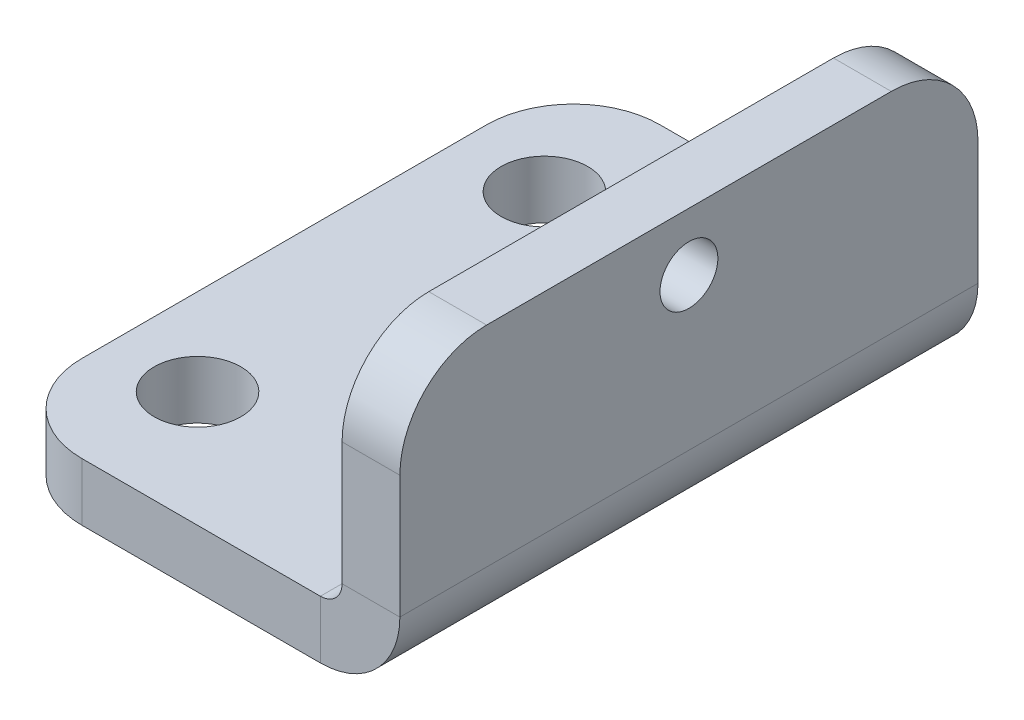
ISO-10303-21;
HEADER;
FILE_DESCRIPTION(('STEP AP214'),'2;1');
FILE_NAME('part.step','',(''),(''),'','','');
FILE_SCHEMA(('AUTOMOTIVE_DESIGN { 1 0 10303 214 1 1 1 1 }'));
ENDSEC;
DATA;
#1=APPLICATION_CONTEXT('core data for automotive mechanical design processes');
#2=APPLICATION_PROTOCOL_DEFINITION('international standard','automotive_design',2000,#1);
#3=PRODUCT_CONTEXT('',#1,'mechanical');
#4=PRODUCT('Part','Part','',(#3));
#5=PRODUCT_RELATED_PRODUCT_CATEGORY('part','',(#4));
#6=PRODUCT_DEFINITION_FORMATION('','',#4);
#7=PRODUCT_DEFINITION_CONTEXT('part definition',#1,'design');
#8=PRODUCT_DEFINITION('design','',#6,#7);
#9=PRODUCT_DEFINITION_SHAPE('','',#8);
#10=(LENGTH_UNIT() NAMED_UNIT(*) SI_UNIT(.MILLI.,.METRE.));
#11=(NAMED_UNIT(*) PLANE_ANGLE_UNIT() SI_UNIT($,.RADIAN.));
#12=(NAMED_UNIT(*) SI_UNIT($,.STERADIAN.) SOLID_ANGLE_UNIT());
#13=UNCERTAINTY_MEASURE_WITH_UNIT(LENGTH_MEASURE(1.E-05),#10,'distance_accuracy_value','');
#14=(GEOMETRIC_REPRESENTATION_CONTEXT(3) GLOBAL_UNCERTAINTY_ASSIGNED_CONTEXT((#13)) GLOBAL_UNIT_ASSIGNED_CONTEXT((#10,
#11,#12)) REPRESENTATION_CONTEXT('',''));
#15=CARTESIAN_POINT('',(0.,0.,0.));
#16=DIRECTION('',(0.,0.,1.));
#17=DIRECTION('',(1.,0.,0.));
#18=AXIS2_PLACEMENT_3D('',#15,#16,#17);
#19=CARTESIAN_POINT('',(0.,0.75,10.));
#20=DIRECTION('',(0.,0.,1.));
#21=DIRECTION('',(1.,0.,0.));
#22=AXIS2_PLACEMENT_3D('',#19,#20,#21);
#23=PLANE('',#22);
#24=DIRECTION('',(1.,0.,0.));
#25=VECTOR('',#24,1.);
#26=CARTESIAN_POINT('',(0.,0.75,10.));
#27=LINE('',#26,#25);
#28=CARTESIAN_POINT('',(0.,0.75,10.));
#29=VERTEX_POINT('',#28);
#30=CARTESIAN_POINT('',(2.,0.75,10.));
#31=VERTEX_POINT('',#30);
#32=EDGE_CURVE('E128',#29,#31,#27,.T.);
#33=ORIENTED_EDGE('',*,*,#32,.F.);
#34=CARTESIAN_POINT('',(-0.75,0.75,10.));
#35=DIRECTION('',(0.,0.,-1.));
#36=DIRECTION('',(-1.,0.,0.));
#37=AXIS2_PLACEMENT_3D('',#34,#35,#36);
#38=CIRCLE('',#37,0.75);
#39=CARTESIAN_POINT('',(-0.750000000000001,0.,10.));
#40=VERTEX_POINT('',#39);
#41=EDGE_CURVE('E132',#40,#29,#38,.F.);
#42=ORIENTED_EDGE('',*,*,#41,.F.);
#43=DIRECTION('',(0.,1.,0.));
#44=VECTOR('',#43,1.);
#45=CARTESIAN_POINT('',(-0.750000000000001,-2.,10.));
#46=LINE('',#45,#44);
#47=CARTESIAN_POINT('',(-0.750000000000001,-2.,10.));
#48=VERTEX_POINT('',#47);
#49=EDGE_CURVE('E140',#48,#40,#46,.T.);
#50=ORIENTED_EDGE('',*,*,#49,.F.);
#51=CARTESIAN_POINT('',(-0.75,0.75,10.));
#52=DIRECTION('',(0.,0.,1.));
#53=DIRECTION('',(1.,0.,0.));
#54=AXIS2_PLACEMENT_3D('',#51,#52,#53);
#55=CIRCLE('',#54,2.75);
#56=EDGE_CURVE('E134',#48,#31,#55,.T.);
#57=ORIENTED_EDGE('',*,*,#56,.T.);
#58=EDGE_LOOP('',(#33,#42,#50,#57));
#59=FACE_BOUND('',#58,.T.);
#60=ADVANCED_FACE('F38',(#59),#23,.T.);
#61=CARTESIAN_POINT('',(-0.750000000000001,-2.,10.));
#62=DIRECTION('',(0.,0.,1.));
#63=DIRECTION('',(1.,0.,0.));
#64=AXIS2_PLACEMENT_3D('',#61,#62,#63);
#65=PLANE('',#64);
#66=DIRECTION('',(0.,1.,0.));
#67=VECTOR('',#66,1.);
#68=CARTESIAN_POINT('',(2.,0.,10.));
#69=LINE('',#68,#67);
#70=CARTESIAN_POINT('',(2.,5.,10.));
#71=VERTEX_POINT('',#70);
#72=EDGE_CURVE('E161',#31,#71,#69,.T.);
#73=ORIENTED_EDGE('',*,*,#72,.T.);
#74=DIRECTION('',(1.,0.,0.));
#75=VECTOR('',#74,1.);
#76=CARTESIAN_POINT('',(-0.750000000000001,5.,10.));
#77=LINE('',#76,#75);
#78=CARTESIAN_POINT('',(0.,5.,10.));
#79=VERTEX_POINT('',#78);
#80=EDGE_CURVE('E46',#71,#79,#77,.F.);
#81=ORIENTED_EDGE('',*,*,#80,.T.);
#82=DIRECTION('',(0.,1.,0.));
#83=VECTOR('',#82,1.);
#84=CARTESIAN_POINT('',(0.,0.,10.));
#85=LINE('',#84,#83);
#86=EDGE_CURVE('E149',#29,#79,#85,.T.);
#87=ORIENTED_EDGE('',*,*,#86,.F.);
#88=ORIENTED_EDGE('',*,*,#32,.T.);
#89=EDGE_LOOP('',(#73,#81,#87,#88));
#90=FACE_BOUND('',#89,.T.);
#91=ADVANCED_FACE('F159',(#90),#65,.T.);
#92=CARTESIAN_POINT('',(-0.750000000000001,0.,-10.));
#93=DIRECTION('',(0.,0.,-1.));
#94=DIRECTION('',(-1.,0.,0.));
#95=AXIS2_PLACEMENT_3D('',#92,#93,#94);
#96=PLANE('',#95);
#97=DIRECTION('',(0.,-1.,0.));
#98=VECTOR('',#97,1.);
#99=CARTESIAN_POINT('',(-0.750000000000001,0.,-10.));
#100=LINE('',#99,#98);
#101=CARTESIAN_POINT('',(-0.750000000000001,0.,-10.));
#102=VERTEX_POINT('',#101);
#103=CARTESIAN_POINT('',(-0.750000000000001,-2.,-10.));
#104=VERTEX_POINT('',#103);
#105=EDGE_CURVE('E205',#102,#104,#100,.T.);
#106=ORIENTED_EDGE('',*,*,#105,.F.);
#107=CARTESIAN_POINT('',(-0.75,0.75,-10.));
#108=DIRECTION('',(0.,0.,-1.));
#109=DIRECTION('',(-1.,0.,0.));
#110=AXIS2_PLACEMENT_3D('',#107,#108,#109);
#111=CIRCLE('',#110,0.75);
#112=CARTESIAN_POINT('',(0.,0.75,-10.));
#113=VERTEX_POINT('',#112);
#114=EDGE_CURVE('E180',#102,#113,#111,.F.);
#115=ORIENTED_EDGE('',*,*,#114,.T.);
#116=DIRECTION('',(-1.,0.,0.));
#117=VECTOR('',#116,1.);
#118=CARTESIAN_POINT('',(2.,0.75,-10.));
#119=LINE('',#118,#117);
#120=CARTESIAN_POINT('',(2.,0.75,-10.));
#121=VERTEX_POINT('',#120);
#122=EDGE_CURVE('E203',#121,#113,#119,.T.);
#123=ORIENTED_EDGE('',*,*,#122,.F.);
#124=CARTESIAN_POINT('',(-0.75,0.75,-10.));
#125=DIRECTION('',(0.,0.,1.));
#126=DIRECTION('',(1.,0.,0.));
#127=AXIS2_PLACEMENT_3D('',#124,#125,#126);
#128=CIRCLE('',#127,2.75);
#129=EDGE_CURVE('E186',#104,#121,#128,.T.);
#130=ORIENTED_EDGE('',*,*,#129,.F.);
#131=EDGE_LOOP('',(#106,#115,#123,#130));
#132=FACE_BOUND('',#131,.T.);
#133=ADVANCED_FACE('F312',(#132),#96,.T.);
#134=CARTESIAN_POINT('',(2.,0.75,-10.));
#135=DIRECTION('',(0.,0.,-1.));
#136=DIRECTION('',(-1.,0.,0.));
#137=AXIS2_PLACEMENT_3D('',#134,#135,#136);
#138=PLANE('',#137);
#139=DIRECTION('',(1.,0.,0.));
#140=VECTOR('',#139,1.);
#141=CARTESIAN_POINT('',(-12.,-2.,-10.));
#142=LINE('',#141,#140);
#143=CARTESIAN_POINT('',(-9.,-2.,-10.));
#144=VERTEX_POINT('',#143);
#145=EDGE_CURVE('E184',#144,#104,#142,.T.);
#146=ORIENTED_EDGE('',*,*,#145,.F.);
#147=DIRECTION('',(0.,1.,0.));
#148=VECTOR('',#147,1.);
#149=CARTESIAN_POINT('',(-9.,0.75,-10.));
#150=LINE('',#149,#148);
#151=CARTESIAN_POINT('',(-9.,0.,-10.));
#152=VERTEX_POINT('',#151);
#153=EDGE_CURVE('E225',#144,#152,#150,.T.);
#154=ORIENTED_EDGE('',*,*,#153,.T.);
#155=DIRECTION('',(1.,0.,0.));
#156=VECTOR('',#155,1.);
#157=CARTESIAN_POINT('',(-12.,0.,-10.));
#158=LINE('',#157,#156);
#159=EDGE_CURVE('E182',#152,#102,#158,.T.);
#160=ORIENTED_EDGE('',*,*,#159,.T.);
#161=ORIENTED_EDGE('',*,*,#105,.T.);
#162=EDGE_LOOP('',(#146,#154,#160,#161));
#163=FACE_BOUND('',#162,.T.);
#164=ADVANCED_FACE('F247',(#163),#138,.T.);
#165=CARTESIAN_POINT('',(2.,0.,10.));
#166=DIRECTION('',(-1.,0.,0.));
#167=DIRECTION('',(0.,0.,1.));
#168=AXIS2_PLACEMENT_3D('',#165,#166,#167);
#169=PLANE('',#168);
#170=CARTESIAN_POINT('',(2.,6.,0.));
#171=DIRECTION('',(-1.,0.,0.));
#172=DIRECTION('',(0.,0.,1.));
#173=AXIS2_PLACEMENT_3D('',#170,#171,#172);
#174=CIRCLE('',#173,1.);
#175=CARTESIAN_POINT('',(2.,6.,1.));
#176=VERTEX_POINT('',#175);
#177=EDGE_CURVE('E277',#176,#176,#174,.T.);
#178=ORIENTED_EDGE('',*,*,#177,.T.);
#179=EDGE_LOOP('',(#178));
#180=FACE_BOUND('',#179,.T.);
#181=DIRECTION('',(0.,1.,0.));
#182=VECTOR('',#181,1.);
#183=CARTESIAN_POINT('',(2.,0.,-10.));
#184=LINE('',#183,#182);
#185=CARTESIAN_POINT('',(2.,5.,-10.));
#186=VERTEX_POINT('',#185);
#187=EDGE_CURVE('E175',#121,#186,#184,.T.);
#188=ORIENTED_EDGE('',*,*,#187,.T.);
#189=CARTESIAN_POINT('',(2.,5.,-7.));
#190=DIRECTION('',(-1.,0.,0.));
#191=DIRECTION('',(0.,0.,1.));
#192=AXIS2_PLACEMENT_3D('',#189,#190,#191);
#193=CIRCLE('',#192,3.);
#194=CARTESIAN_POINT('',(2.,8.,-7.));
#195=VERTEX_POINT('',#194);
#196=EDGE_CURVE('E214',#186,#195,#193,.F.);
#197=ORIENTED_EDGE('',*,*,#196,.T.);
#198=DIRECTION('',(0.,0.,-1.));
#199=VECTOR('',#198,1.);
#200=CARTESIAN_POINT('',(2.,8.,10.));
#201=LINE('',#200,#199);
#202=CARTESIAN_POINT('',(2.,8.,7.));
#203=VERTEX_POINT('',#202);
#204=EDGE_CURVE('E200',#203,#195,#201,.T.);
#205=ORIENTED_EDGE('',*,*,#204,.F.);
#206=CARTESIAN_POINT('',(2.,5.,7.));
#207=DIRECTION('',(-1.,0.,0.));
#208=DIRECTION('',(0.,0.,1.));
#209=AXIS2_PLACEMENT_3D('',#206,#207,#208);
#210=CIRCLE('',#209,3.);
#211=EDGE_CURVE('E212',#203,#71,#210,.F.);
#212=ORIENTED_EDGE('',*,*,#211,.T.);
#213=ORIENTED_EDGE('',*,*,#72,.F.);
#214=DIRECTION('',(0.,0.,-1.));
#215=VECTOR('',#214,1.);
#216=CARTESIAN_POINT('',(2.,0.75,10.));
#217=LINE('',#216,#215);
#218=EDGE_CURVE('E174',#31,#121,#217,.T.);
#219=ORIENTED_EDGE('',*,*,#218,.T.);
#220=EDGE_LOOP('',(#188,#197,#205,#212,#213,#219));
#221=FACE_BOUND('',#220,.T.);
#222=ADVANCED_FACE('F265',(#180,#221),#169,.F.);
#223=CARTESIAN_POINT('',(0.,8.,10.));
#224=DIRECTION('',(0.,1.,0.));
#225=DIRECTION('',(0.,0.,1.));
#226=AXIS2_PLACEMENT_3D('',#223,#224,#225);
#227=PLANE('',#226);
#228=ORIENTED_EDGE('',*,*,#204,.T.);
#229=DIRECTION('',(1.,0.,0.));
#230=VECTOR('',#229,1.);
#231=CARTESIAN_POINT('',(0.,8.,-7.));
#232=LINE('',#231,#230);
#233=CARTESIAN_POINT('',(0.,8.,-7.));
#234=VERTEX_POINT('',#233);
#235=EDGE_CURVE('E219',#195,#234,#232,.F.);
#236=ORIENTED_EDGE('',*,*,#235,.T.);
#237=DIRECTION('',(0.,0.,-1.));
#238=VECTOR('',#237,1.);
#239=CARTESIAN_POINT('',(0.,8.,10.));
#240=LINE('',#239,#238);
#241=CARTESIAN_POINT('',(0.,8.,7.));
#242=VERTEX_POINT('',#241);
#243=EDGE_CURVE('E156',#242,#234,#240,.T.);
#244=ORIENTED_EDGE('',*,*,#243,.F.);
#245=DIRECTION('',(1.,0.,0.));
#246=VECTOR('',#245,1.);
#247=CARTESIAN_POINT('',(0.,8.,7.));
#248=LINE('',#247,#246);
#249=EDGE_CURVE('E216',#242,#203,#248,.T.);
#250=ORIENTED_EDGE('',*,*,#249,.T.);
#251=EDGE_LOOP('',(#228,#236,#244,#250));
#252=FACE_BOUND('',#251,.T.);
#253=ADVANCED_FACE('F295',(#252),#227,.T.);
#254=CARTESIAN_POINT('',(0.,0.,10.));
#255=DIRECTION('',(-1.,0.,0.));
#256=DIRECTION('',(0.,0.,1.));
#257=AXIS2_PLACEMENT_3D('',#254,#255,#256);
#258=PLANE('',#257);
#259=CARTESIAN_POINT('',(0.,6.,0.));
#260=DIRECTION('',(-1.,0.,0.));
#261=DIRECTION('',(0.,0.,1.));
#262=AXIS2_PLACEMENT_3D('',#259,#260,#261);
#263=CIRCLE('',#262,1.);
#264=CARTESIAN_POINT('',(0.,6.,1.));
#265=VERTEX_POINT('',#264);
#266=EDGE_CURVE('E280',#265,#265,#263,.T.);
#267=ORIENTED_EDGE('',*,*,#266,.F.);
#268=EDGE_LOOP('',(#267));
#269=FACE_BOUND('',#268,.T.);
#270=ORIENTED_EDGE('',*,*,#243,.T.);
#271=CARTESIAN_POINT('',(0.,5.,-7.));
#272=DIRECTION('',(-1.,0.,0.));
#273=DIRECTION('',(0.,0.,1.));
#274=AXIS2_PLACEMENT_3D('',#271,#272,#273);
#275=CIRCLE('',#274,3.);
#276=CARTESIAN_POINT('',(0.,5.,-10.));
#277=VERTEX_POINT('',#276);
#278=EDGE_CURVE('E223',#234,#277,#275,.T.);
#279=ORIENTED_EDGE('',*,*,#278,.T.);
#280=DIRECTION('',(0.,1.,0.));
#281=VECTOR('',#280,1.);
#282=CARTESIAN_POINT('',(0.,0.,-10.));
#283=LINE('',#282,#281);
#284=EDGE_CURVE('E152',#113,#277,#283,.T.);
#285=ORIENTED_EDGE('',*,*,#284,.F.);
#286=DIRECTION('',(0.,0.,-1.));
#287=VECTOR('',#286,1.);
#288=CARTESIAN_POINT('',(0.,0.75,10.));
#289=LINE('',#288,#287);
#290=EDGE_CURVE('E146',#29,#113,#289,.T.);
#291=ORIENTED_EDGE('',*,*,#290,.F.);
#292=ORIENTED_EDGE('',*,*,#86,.T.);
#293=CARTESIAN_POINT('',(0.,5.,7.));
#294=DIRECTION('',(-1.,0.,0.));
#295=DIRECTION('',(0.,0.,1.));
#296=AXIS2_PLACEMENT_3D('',#293,#294,#295);
#297=CIRCLE('',#296,3.);
#298=EDGE_CURVE('E221',#79,#242,#297,.T.);
#299=ORIENTED_EDGE('',*,*,#298,.T.);
#300=EDGE_LOOP('',(#270,#279,#285,#291,#292,#299));
#301=FACE_BOUND('',#300,.T.);
#302=ADVANCED_FACE('F148',(#269,#301),#258,.T.);
#303=CARTESIAN_POINT('',(-0.75,0.75,10.));
#304=DIRECTION('',(0.,0.,-1.));
#305=DIRECTION('',(-1.,0.,0.));
#306=AXIS2_PLACEMENT_3D('',#303,#304,#305);
#307=CYLINDRICAL_SURFACE('',#306,0.75);
#308=ORIENTED_EDGE('',*,*,#114,.F.);
#309=DIRECTION('',(0.,0.,-1.));
#310=VECTOR('',#309,1.);
#311=CARTESIAN_POINT('',(-0.750000000000001,0.,10.));
#312=LINE('',#311,#310);
#313=EDGE_CURVE('E157',#40,#102,#312,.T.);
#314=ORIENTED_EDGE('',*,*,#313,.F.);
#315=ORIENTED_EDGE('',*,*,#41,.T.);
#316=ORIENTED_EDGE('',*,*,#290,.T.);
#317=EDGE_LOOP('',(#308,#314,#315,#316));
#318=FACE_BOUND('',#317,.T.);
#319=ADVANCED_FACE('F164',(#318),#307,.F.);
#320=CARTESIAN_POINT('',(-12.,0.,10.));
#321=DIRECTION('',(0.,1.,0.));
#322=DIRECTION('',(0.,0.,1.));
#323=AXIS2_PLACEMENT_3D('',#320,#321,#322);
#324=PLANE('',#323);
#325=CARTESIAN_POINT('',(-9.,0.,6.));
#326=DIRECTION('',(0.,1.,0.));
#327=DIRECTION('',(0.,0.,-1.));
#328=AXIS2_PLACEMENT_3D('',#325,#326,#327);
#329=CIRCLE('',#328,1.5);
#330=CARTESIAN_POINT('',(-9.,0.,4.5));
#331=VERTEX_POINT('',#330);
#332=EDGE_CURVE('E274',#331,#331,#329,.T.);
#333=ORIENTED_EDGE('',*,*,#332,.F.);
#334=EDGE_LOOP('',(#333));
#335=FACE_BOUND('',#334,.T.);
#336=CARTESIAN_POINT('',(-9.,0.,-6.));
#337=DIRECTION('',(0.,1.,0.));
#338=DIRECTION('',(0.,0.,1.));
#339=AXIS2_PLACEMENT_3D('',#336,#337,#338);
#340=CIRCLE('',#339,1.5);
#341=CARTESIAN_POINT('',(-9.,0.,-4.5));
#342=VERTEX_POINT('',#341);
#343=EDGE_CURVE('E268',#342,#342,#340,.T.);
#344=ORIENTED_EDGE('',*,*,#343,.F.);
#345=EDGE_LOOP('',(#344));
#346=FACE_BOUND('',#345,.T.);
#347=ORIENTED_EDGE('',*,*,#159,.F.);
#348=CARTESIAN_POINT('',(-9.,0.,-7.));
#349=DIRECTION('',(0.,1.,0.));
#350=DIRECTION('',(0.,0.,1.));
#351=AXIS2_PLACEMENT_3D('',#348,#349,#350);
#352=CIRCLE('',#351,3.);
#353=CARTESIAN_POINT('',(-12.,0.,-7.));
#354=VERTEX_POINT('',#353);
#355=EDGE_CURVE('E230',#152,#354,#352,.T.);
#356=ORIENTED_EDGE('',*,*,#355,.T.);
#357=DIRECTION('',(0.,0.,-1.));
#358=VECTOR('',#357,1.);
#359=CARTESIAN_POINT('',(-12.,0.,10.));
#360=LINE('',#359,#358);
#361=CARTESIAN_POINT('',(-12.,0.,7.));
#362=VERTEX_POINT('',#361);
#363=EDGE_CURVE('E196',#362,#354,#360,.T.);
#364=ORIENTED_EDGE('',*,*,#363,.F.);
#365=CARTESIAN_POINT('',(-9.,0.,7.));
#366=DIRECTION('',(0.,1.,0.));
#367=DIRECTION('',(0.,0.,1.));
#368=AXIS2_PLACEMENT_3D('',#365,#366,#367);
#369=CIRCLE('',#368,3.);
#370=CARTESIAN_POINT('',(-9.,0.,10.));
#371=VERTEX_POINT('',#370);
#372=EDGE_CURVE('E228',#362,#371,#369,.T.);
#373=ORIENTED_EDGE('',*,*,#372,.T.);
#374=DIRECTION('',(1.,0.,0.));
#375=VECTOR('',#374,1.);
#376=CARTESIAN_POINT('',(-12.,0.,10.));
#377=LINE('',#376,#375);
#378=EDGE_CURVE('E166',#371,#40,#377,.T.);
#379=ORIENTED_EDGE('',*,*,#378,.T.);
#380=ORIENTED_EDGE('',*,*,#313,.T.);
#381=EDGE_LOOP('',(#347,#356,#364,#373,#379,#380));
#382=FACE_BOUND('',#381,.T.);
#383=ADVANCED_FACE('F253',(#335,#346,#382),#324,.T.);
#384=CARTESIAN_POINT('',(-12.,-2.,10.));
#385=DIRECTION('',(-1.,0.,0.));
#386=DIRECTION('',(0.,0.,1.));
#387=AXIS2_PLACEMENT_3D('',#384,#385,#386);
#388=PLANE('',#387);
#389=ORIENTED_EDGE('',*,*,#363,.T.);
#390=DIRECTION('',(0.,1.,0.));
#391=VECTOR('',#390,1.);
#392=CARTESIAN_POINT('',(-12.,-2.,-7.));
#393=LINE('',#392,#391);
#394=CARTESIAN_POINT('',(-12.,-2.,-7.));
#395=VERTEX_POINT('',#394);
#396=EDGE_CURVE('E59',#354,#395,#393,.F.);
#397=ORIENTED_EDGE('',*,*,#396,.T.);
#398=DIRECTION('',(0.,0.,-1.));
#399=VECTOR('',#398,1.);
#400=CARTESIAN_POINT('',(-12.,-2.,10.));
#401=LINE('',#400,#399);
#402=CARTESIAN_POINT('',(-12.,-2.,7.));
#403=VERTEX_POINT('',#402);
#404=EDGE_CURVE('E194',#403,#395,#401,.T.);
#405=ORIENTED_EDGE('',*,*,#404,.F.);
#406=DIRECTION('',(0.,1.,0.));
#407=VECTOR('',#406,1.);
#408=CARTESIAN_POINT('',(-12.,0.,7.));
#409=LINE('',#408,#407);
#410=EDGE_CURVE('E232',#403,#362,#409,.T.);
#411=ORIENTED_EDGE('',*,*,#410,.T.);
#412=EDGE_LOOP('',(#389,#397,#405,#411));
#413=FACE_BOUND('',#412,.T.);
#414=ADVANCED_FACE('F254',(#413),#388,.T.);
#415=CARTESIAN_POINT('',(-12.,-2.,10.));
#416=DIRECTION('',(0.,1.,0.));
#417=DIRECTION('',(0.,0.,1.));
#418=AXIS2_PLACEMENT_3D('',#415,#416,#417);
#419=PLANE('',#418);
#420=CARTESIAN_POINT('',(-9.,-2.,6.));
#421=DIRECTION('',(0.,1.,0.));
#422=DIRECTION('',(0.,0.,-1.));
#423=AXIS2_PLACEMENT_3D('',#420,#421,#422);
#424=CIRCLE('',#423,1.5);
#425=CARTESIAN_POINT('',(-9.,-2.,4.5));
#426=VERTEX_POINT('',#425);
#427=EDGE_CURVE('E271',#426,#426,#424,.T.);
#428=ORIENTED_EDGE('',*,*,#427,.T.);
#429=EDGE_LOOP('',(#428));
#430=FACE_BOUND('',#429,.T.);
#431=CARTESIAN_POINT('',(-9.,-2.,-6.));
#432=DIRECTION('',(0.,1.,0.));
#433=DIRECTION('',(0.,0.,1.));
#434=AXIS2_PLACEMENT_3D('',#431,#432,#433);
#435=CIRCLE('',#434,1.5);
#436=CARTESIAN_POINT('',(-9.,-2.,-4.5));
#437=VERTEX_POINT('',#436);
#438=EDGE_CURVE('E178',#437,#437,#435,.T.);
#439=ORIENTED_EDGE('',*,*,#438,.T.);
#440=EDGE_LOOP('',(#439));
#441=FACE_BOUND('',#440,.T.);
#442=ORIENTED_EDGE('',*,*,#404,.T.);
#443=CARTESIAN_POINT('',(-9.,-2.,-7.));
#444=DIRECTION('',(0.,1.,0.));
#445=DIRECTION('',(0.,0.,1.));
#446=AXIS2_PLACEMENT_3D('',#443,#444,#445);
#447=CIRCLE('',#446,3.);
#448=EDGE_CURVE('E238',#395,#144,#447,.F.);
#449=ORIENTED_EDGE('',*,*,#448,.T.);
#450=ORIENTED_EDGE('',*,*,#145,.T.);
#451=DIRECTION('',(0.,0.,-1.));
#452=VECTOR('',#451,1.);
#453=CARTESIAN_POINT('',(-0.750000000000001,-2.,10.));
#454=LINE('',#453,#452);
#455=EDGE_CURVE('E191',#48,#104,#454,.T.);
#456=ORIENTED_EDGE('',*,*,#455,.F.);
#457=DIRECTION('',(1.,0.,0.));
#458=VECTOR('',#457,1.);
#459=CARTESIAN_POINT('',(-12.,-2.,10.));
#460=LINE('',#459,#458);
#461=CARTESIAN_POINT('',(-9.,-2.,10.));
#462=VERTEX_POINT('',#461);
#463=EDGE_CURVE('E168',#462,#48,#460,.T.);
#464=ORIENTED_EDGE('',*,*,#463,.F.);
#465=CARTESIAN_POINT('',(-9.,-2.,7.));
#466=DIRECTION('',(0.,1.,0.));
#467=DIRECTION('',(0.,0.,1.));
#468=AXIS2_PLACEMENT_3D('',#465,#466,#467);
#469=CIRCLE('',#468,3.);
#470=EDGE_CURVE('E236',#462,#403,#469,.F.);
#471=ORIENTED_EDGE('',*,*,#470,.T.);
#472=EDGE_LOOP('',(#442,#449,#450,#456,#464,#471));
#473=FACE_BOUND('',#472,.T.);
#474=ADVANCED_FACE('F242',(#430,#441,#473),#419,.F.);
#475=CARTESIAN_POINT('',(-0.75,0.75,10.));
#476=DIRECTION('',(0.,0.,-1.));
#477=DIRECTION('',(-1.,0.,0.));
#478=AXIS2_PLACEMENT_3D('',#475,#476,#477);
#479=CYLINDRICAL_SURFACE('',#478,2.75);
#480=ORIENTED_EDGE('',*,*,#129,.T.);
#481=ORIENTED_EDGE('',*,*,#218,.F.);
#482=ORIENTED_EDGE('',*,*,#56,.F.);
#483=ORIENTED_EDGE('',*,*,#455,.T.);
#484=EDGE_LOOP('',(#480,#481,#482,#483));
#485=FACE_BOUND('',#484,.T.);
#486=ADVANCED_FACE('F261',(#485),#479,.T.);
#487=CARTESIAN_POINT('',(-0.75,0.75,10.));
#488=DIRECTION('',(0.,0.,-1.));
#489=DIRECTION('',(-1.,0.,0.));
#490=AXIS2_PLACEMENT_3D('',#487,#488,#489);
#491=PLANE('',#490);
#492=ORIENTED_EDGE('',*,*,#378,.F.);
#493=DIRECTION('',(0.,1.,0.));
#494=VECTOR('',#493,1.);
#495=CARTESIAN_POINT('',(-9.,-2.,10.));
#496=LINE('',#495,#494);
#497=EDGE_CURVE('E11',#371,#462,#496,.F.);
#498=ORIENTED_EDGE('',*,*,#497,.T.);
#499=ORIENTED_EDGE('',*,*,#463,.T.);
#500=ORIENTED_EDGE('',*,*,#49,.T.);
#501=EDGE_LOOP('',(#492,#498,#499,#500));
#502=FACE_BOUND('',#501,.T.);
#503=ADVANCED_FACE('F258',(#502),#491,.F.);
#504=CARTESIAN_POINT('',(-0.75,0.75,-10.));
#505=DIRECTION('',(0.,0.,-1.));
#506=DIRECTION('',(-1.,0.,0.));
#507=AXIS2_PLACEMENT_3D('',#504,#505,#506);
#508=PLANE('',#507);
#509=ORIENTED_EDGE('',*,*,#284,.T.);
#510=DIRECTION('',(1.,0.,0.));
#511=VECTOR('',#510,1.);
#512=CARTESIAN_POINT('',(-0.75,5.,-10.));
#513=LINE('',#512,#511);
#514=EDGE_CURVE('E139',#277,#186,#513,.T.);
#515=ORIENTED_EDGE('',*,*,#514,.T.);
#516=ORIENTED_EDGE('',*,*,#187,.F.);
#517=ORIENTED_EDGE('',*,*,#122,.T.);
#518=EDGE_LOOP('',(#509,#515,#516,#517));
#519=FACE_BOUND('',#518,.T.);
#520=ADVANCED_FACE('F319',(#519),#508,.T.);
#521=CARTESIAN_POINT('',(-0.75,5.,-7.));
#522=DIRECTION('',(1.,0.,0.));
#523=DIRECTION('',(0.,0.,-1.));
#524=AXIS2_PLACEMENT_3D('',#521,#522,#523);
#525=CYLINDRICAL_SURFACE('',#524,3.);
#526=ORIENTED_EDGE('',*,*,#278,.F.);
#527=ORIENTED_EDGE('',*,*,#235,.F.);
#528=ORIENTED_EDGE('',*,*,#196,.F.);
#529=ORIENTED_EDGE('',*,*,#514,.F.);
#530=EDGE_LOOP('',(#526,#527,#528,#529));
#531=FACE_BOUND('',#530,.T.);
#532=ADVANCED_FACE('F316',(#531),#525,.T.);
#533=CARTESIAN_POINT('',(-9.,0.75,-7.));
#534=DIRECTION('',(0.,1.,0.));
#535=DIRECTION('',(0.,0.,1.));
#536=AXIS2_PLACEMENT_3D('',#533,#534,#535);
#537=CYLINDRICAL_SURFACE('',#536,3.);
#538=ORIENTED_EDGE('',*,*,#448,.F.);
#539=ORIENTED_EDGE('',*,*,#396,.F.);
#540=ORIENTED_EDGE('',*,*,#355,.F.);
#541=ORIENTED_EDGE('',*,*,#153,.F.);
#542=EDGE_LOOP('',(#538,#539,#540,#541));
#543=FACE_BOUND('',#542,.T.);
#544=ADVANCED_FACE('F250',(#543),#537,.T.);
#545=CARTESIAN_POINT('',(0.,5.,7.));
#546=DIRECTION('',(1.,0.,0.));
#547=DIRECTION('',(0.,0.,-1.));
#548=AXIS2_PLACEMENT_3D('',#545,#546,#547);
#549=CYLINDRICAL_SURFACE('',#548,3.);
#550=ORIENTED_EDGE('',*,*,#298,.F.);
#551=ORIENTED_EDGE('',*,*,#80,.F.);
#552=ORIENTED_EDGE('',*,*,#211,.F.);
#553=ORIENTED_EDGE('',*,*,#249,.F.);
#554=EDGE_LOOP('',(#550,#551,#552,#553));
#555=FACE_BOUND('',#554,.T.);
#556=ADVANCED_FACE('F322',(#555),#549,.T.);
#557=CARTESIAN_POINT('',(-9.,-2.,7.));
#558=DIRECTION('',(0.,-1.,0.));
#559=DIRECTION('',(0.,0.,-1.));
#560=AXIS2_PLACEMENT_3D('',#557,#558,#559);
#561=CYLINDRICAL_SURFACE('',#560,3.);
#562=ORIENTED_EDGE('',*,*,#470,.F.);
#563=ORIENTED_EDGE('',*,*,#497,.F.);
#564=ORIENTED_EDGE('',*,*,#372,.F.);
#565=ORIENTED_EDGE('',*,*,#410,.F.);
#566=EDGE_LOOP('',(#562,#563,#564,#565));
#567=FACE_BOUND('',#566,.T.);
#568=ADVANCED_FACE('F40',(#567),#561,.T.);
#569=CARTESIAN_POINT('',(-9.,-2.,-6.));
#570=DIRECTION('',(0.,1.,0.));
#571=DIRECTION('',(0.,0.,1.));
#572=AXIS2_PLACEMENT_3D('',#569,#570,#571);
#573=CYLINDRICAL_SURFACE('',#572,1.5);
#574=ORIENTED_EDGE('',*,*,#438,.F.);
#575=EDGE_LOOP('',(#574));
#576=FACE_BOUND('',#575,.T.);
#577=ORIENTED_EDGE('',*,*,#343,.T.);
#578=EDGE_LOOP('',(#577));
#579=FACE_BOUND('',#578,.T.);
#580=ADVANCED_FACE('F328',(#576,#579),#573,.F.);
#581=CARTESIAN_POINT('',(-9.,-2.,6.));
#582=DIRECTION('',(0.,1.,0.));
#583=DIRECTION('',(0.,0.,1.));
#584=AXIS2_PLACEMENT_3D('',#581,#582,#583);
#585=CYLINDRICAL_SURFACE('',#584,1.5);
#586=ORIENTED_EDGE('',*,*,#427,.F.);
#587=EDGE_LOOP('',(#586));
#588=FACE_BOUND('',#587,.T.);
#589=ORIENTED_EDGE('',*,*,#332,.T.);
#590=EDGE_LOOP('',(#589));
#591=FACE_BOUND('',#590,.T.);
#592=ADVANCED_FACE('F290',(#588,#591),#585,.F.);
#593=CARTESIAN_POINT('',(2.,6.,0.));
#594=DIRECTION('',(-1.,0.,0.));
#595=DIRECTION('',(0.,0.,1.));
#596=AXIS2_PLACEMENT_3D('',#593,#594,#595);
#597=CYLINDRICAL_SURFACE('',#596,1.);
#598=ORIENTED_EDGE('',*,*,#177,.F.);
#599=EDGE_LOOP('',(#598));
#600=FACE_BOUND('',#599,.T.);
#601=ORIENTED_EDGE('',*,*,#266,.T.);
#602=EDGE_LOOP('',(#601));
#603=FACE_BOUND('',#602,.T.);
#604=ADVANCED_FACE('F287',(#600,#603),#597,.F.);
#605=CLOSED_SHELL('',(#60,#91,#133,#164,#222,#253,#302,#319,#383,#414,#474,#486,#503,#520,#532,
#544,#556,#568,#580,#592,#604));
#606=MANIFOLD_SOLID_BREP('B2',#605);
#607=ADVANCED_BREP_SHAPE_REPRESENTATION('',(#18,#606),#14);
#608=SHAPE_DEFINITION_REPRESENTATION(#9,#607);
ENDSEC;
END-ISO-10303-21;
